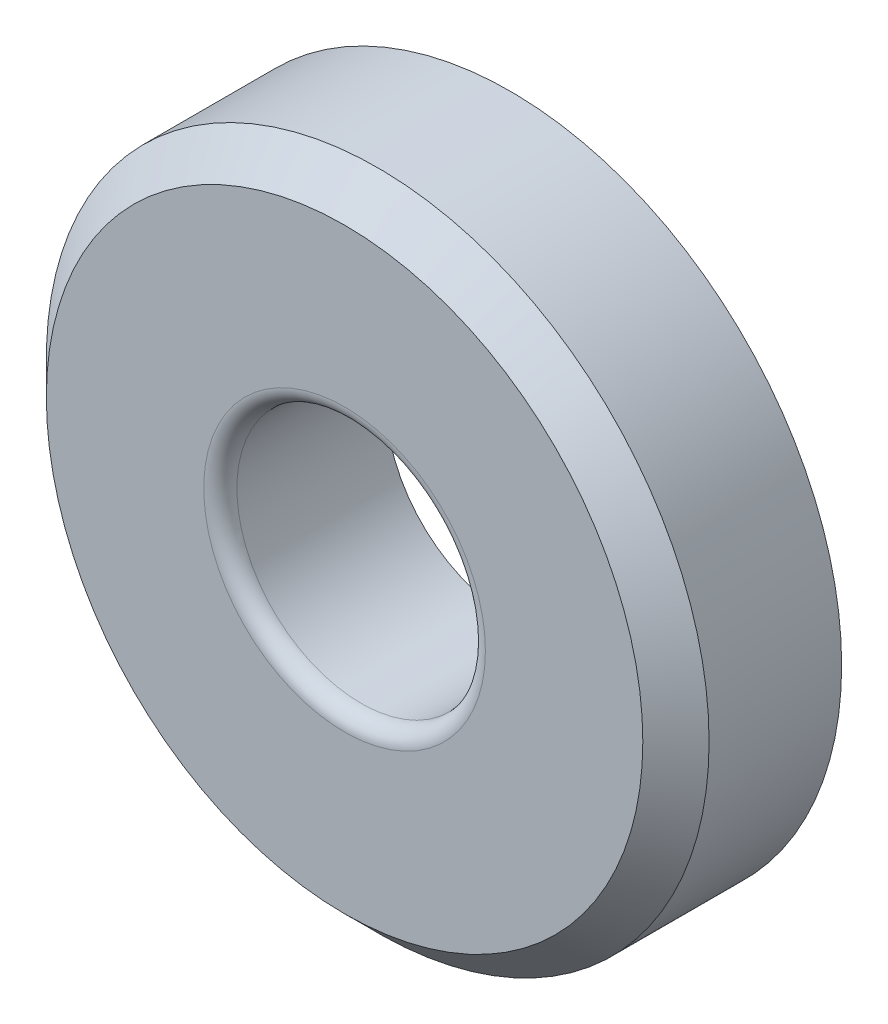
ISO-10303-21;
HEADER;
FILE_DESCRIPTION(('STEP AP214'),'2;1');
FILE_NAME('part.step','',(''),(''),'','','');
FILE_SCHEMA(('AUTOMOTIVE_DESIGN { 1 0 10303 214 1 1 1 1 }'));
ENDSEC;
DATA;
#1=APPLICATION_CONTEXT('core data for automotive mechanical design processes');
#2=APPLICATION_PROTOCOL_DEFINITION('international standard','automotive_design',2000,#1);
#3=PRODUCT_CONTEXT('',#1,'mechanical');
#4=PRODUCT('Part','Part','',(#3));
#5=PRODUCT_RELATED_PRODUCT_CATEGORY('part','',(#4));
#6=PRODUCT_DEFINITION_FORMATION('','',#4);
#7=PRODUCT_DEFINITION_CONTEXT('part definition',#1,'design');
#8=PRODUCT_DEFINITION('design','',#6,#7);
#9=PRODUCT_DEFINITION_SHAPE('','',#8);
#10=(LENGTH_UNIT() NAMED_UNIT(*) SI_UNIT(.MILLI.,.METRE.));
#11=(NAMED_UNIT(*) PLANE_ANGLE_UNIT() SI_UNIT($,.RADIAN.));
#12=(NAMED_UNIT(*) SI_UNIT($,.STERADIAN.) SOLID_ANGLE_UNIT());
#13=UNCERTAINTY_MEASURE_WITH_UNIT(LENGTH_MEASURE(1.E-05),#10,'distance_accuracy_value','');
#14=(GEOMETRIC_REPRESENTATION_CONTEXT(3) GLOBAL_UNCERTAINTY_ASSIGNED_CONTEXT((#13)) GLOBAL_UNIT_ASSIGNED_CONTEXT((#10,
#11,#12)) REPRESENTATION_CONTEXT('',''));
#15=CARTESIAN_POINT('',(0.,0.,0.));
#16=DIRECTION('',(0.,0.,1.));
#17=DIRECTION('',(1.,0.,0.));
#18=AXIS2_PLACEMENT_3D('',#15,#16,#17);
#19=CARTESIAN_POINT('',(0.,0.,12.7));
#20=DIRECTION('',(0.,0.,1.));
#21=DIRECTION('',(1.,0.,0.));
#22=AXIS2_PLACEMENT_3D('',#19,#20,#21);
#23=PLANE('',#22);
#24=CARTESIAN_POINT('',(0.,0.,12.7));
#25=DIRECTION('',(0.,0.,1.));
#26=DIRECTION('',(1.,0.,0.));
#27=AXIS2_PLACEMENT_3D('',#24,#25,#26);
#28=CIRCLE('',#27,10.795);
#29=CARTESIAN_POINT('',(10.795,0.,12.7));
#30=VERTEX_POINT('',#29);
#31=EDGE_CURVE('E10',#30,#30,#28,.F.);
#32=ORIENTED_EDGE('',*,*,#31,.T.);
#33=EDGE_LOOP('',(#32));
#34=FACE_BOUND('',#33,.T.);
#35=CARTESIAN_POINT('',(0.,0.,12.7));
#36=DIRECTION('',(0.,0.,1.));
#37=DIRECTION('',(1.,0.,0.));
#38=AXIS2_PLACEMENT_3D('',#35,#36,#37);
#39=CIRCLE('',#38,22.86);
#40=CARTESIAN_POINT('',(22.86,0.,12.7));
#41=VERTEX_POINT('',#40);
#42=EDGE_CURVE('E61',#41,#41,#39,.T.);
#43=ORIENTED_EDGE('',*,*,#42,.T.);
#44=EDGE_LOOP('',(#43));
#45=FACE_BOUND('',#44,.T.);
#46=ADVANCED_FACE('F43',(#34,#45),#23,.T.);
#47=CARTESIAN_POINT('',(0.,0.,0.));
#48=DIRECTION('',(0.,0.,1.));
#49=DIRECTION('',(1.,0.,0.));
#50=AXIS2_PLACEMENT_3D('',#47,#48,#49);
#51=PLANE('',#50);
#52=CARTESIAN_POINT('',(0.,0.,0.));
#53=DIRECTION('',(0.,0.,1.));
#54=DIRECTION('',(1.,0.,0.));
#55=AXIS2_PLACEMENT_3D('',#52,#53,#54);
#56=CIRCLE('',#55,25.4);
#57=CARTESIAN_POINT('',(25.4,0.,0.));
#58=VERTEX_POINT('',#57);
#59=EDGE_CURVE('E67',#58,#58,#56,.T.);
#60=ORIENTED_EDGE('',*,*,#59,.F.);
#61=EDGE_LOOP('',(#60));
#62=FACE_BOUND('',#61,.T.);
#63=CARTESIAN_POINT('',(0.,0.,0.));
#64=DIRECTION('',(0.,0.,1.));
#65=DIRECTION('',(1.,0.,0.));
#66=AXIS2_PLACEMENT_3D('',#63,#64,#65);
#67=CIRCLE('',#66,9.525);
#68=CARTESIAN_POINT('',(9.525,0.,0.));
#69=VERTEX_POINT('',#68);
#70=EDGE_CURVE('E71',#69,#69,#67,.T.);
#71=ORIENTED_EDGE('',*,*,#70,.T.);
#72=EDGE_LOOP('',(#71));
#73=FACE_BOUND('',#72,.T.);
#74=ADVANCED_FACE('F76',(#62,#73),#51,.F.);
#75=CARTESIAN_POINT('',(0.,0.,12.7));
#76=DIRECTION('',(0.,0.,-1.));
#77=DIRECTION('',(-1.,0.,0.));
#78=AXIS2_PLACEMENT_3D('',#75,#76,#77);
#79=CYLINDRICAL_SURFACE('',#78,25.4);
#80=CARTESIAN_POINT('',(0.,0.,10.16));
#81=DIRECTION('',(0.,0.,1.));
#82=DIRECTION('',(1.,0.,0.));
#83=AXIS2_PLACEMENT_3D('',#80,#81,#82);
#84=CIRCLE('',#83,25.4);
#85=CARTESIAN_POINT('',(25.4,0.,10.16));
#86=VERTEX_POINT('',#85);
#87=EDGE_CURVE('E56',#86,#86,#84,.F.);
#88=ORIENTED_EDGE('',*,*,#87,.T.);
#89=EDGE_LOOP('',(#88));
#90=FACE_BOUND('',#89,.T.);
#91=ORIENTED_EDGE('',*,*,#59,.T.);
#92=EDGE_LOOP('',(#91));
#93=FACE_BOUND('',#92,.T.);
#94=ADVANCED_FACE('F81',(#90,#93),#79,.T.);
#95=CARTESIAN_POINT('',(0.,0.,12.7));
#96=DIRECTION('',(0.,0.,-1.));
#97=DIRECTION('',(-1.,0.,0.));
#98=AXIS2_PLACEMENT_3D('',#95,#96,#97);
#99=CYLINDRICAL_SURFACE('',#98,9.525);
#100=CARTESIAN_POINT('',(0.,0.,11.43));
#101=DIRECTION('',(0.,0.,1.));
#102=DIRECTION('',(1.,0.,0.));
#103=AXIS2_PLACEMENT_3D('',#100,#101,#102);
#104=CIRCLE('',#103,9.525);
#105=CARTESIAN_POINT('',(9.525,0.,11.43));
#106=VERTEX_POINT('',#105);
#107=EDGE_CURVE('E51',#106,#106,#104,.T.);
#108=ORIENTED_EDGE('',*,*,#107,.T.);
#109=EDGE_LOOP('',(#108));
#110=FACE_BOUND('',#109,.T.);
#111=ORIENTED_EDGE('',*,*,#70,.F.);
#112=EDGE_LOOP('',(#111));
#113=FACE_BOUND('',#112,.T.);
#114=ADVANCED_FACE('F78',(#110,#113),#99,.F.);
#115=CARTESIAN_POINT('',(0.,0.,12.7));
#116=DIRECTION('',(0.,0.,-1.));
#117=DIRECTION('',(-1.,0.,0.));
#118=AXIS2_PLACEMENT_3D('',#115,#116,#117);
#119=CONICAL_SURFACE('',#118,22.86,0.785398163397446);
#120=ORIENTED_EDGE('',*,*,#87,.F.);
#121=EDGE_LOOP('',(#120));
#122=FACE_BOUND('',#121,.T.);
#123=ORIENTED_EDGE('',*,*,#42,.F.);
#124=EDGE_LOOP('',(#123));
#125=FACE_BOUND('',#124,.T.);
#126=ADVANCED_FACE('F80',(#122,#125),#119,.T.);
#127=CARTESIAN_POINT('',(0.,0.,11.43));
#128=DIRECTION('',(0.,0.,1.));
#129=DIRECTION('',(1.,0.,0.));
#130=AXIS2_PLACEMENT_3D('',#127,#128,#129);
#131=TOROIDAL_SURFACE('',#130,10.795,1.27);
#132=ORIENTED_EDGE('',*,*,#31,.F.);
#133=EDGE_LOOP('',(#132));
#134=FACE_BOUND('',#133,.T.);
#135=ORIENTED_EDGE('',*,*,#107,.F.);
#136=EDGE_LOOP('',(#135));
#137=FACE_BOUND('',#136,.T.);
#138=ADVANCED_FACE('F45',(#134,#137),#131,.T.);
#139=CLOSED_SHELL('',(#46,#74,#94,#114,#126,#138));
#140=MANIFOLD_SOLID_BREP('B2',#139);
#141=ADVANCED_BREP_SHAPE_REPRESENTATION('',(#18,#140),#14);
#142=SHAPE_DEFINITION_REPRESENTATION(#9,#141);
ENDSEC;
END-ISO-10303-21;
